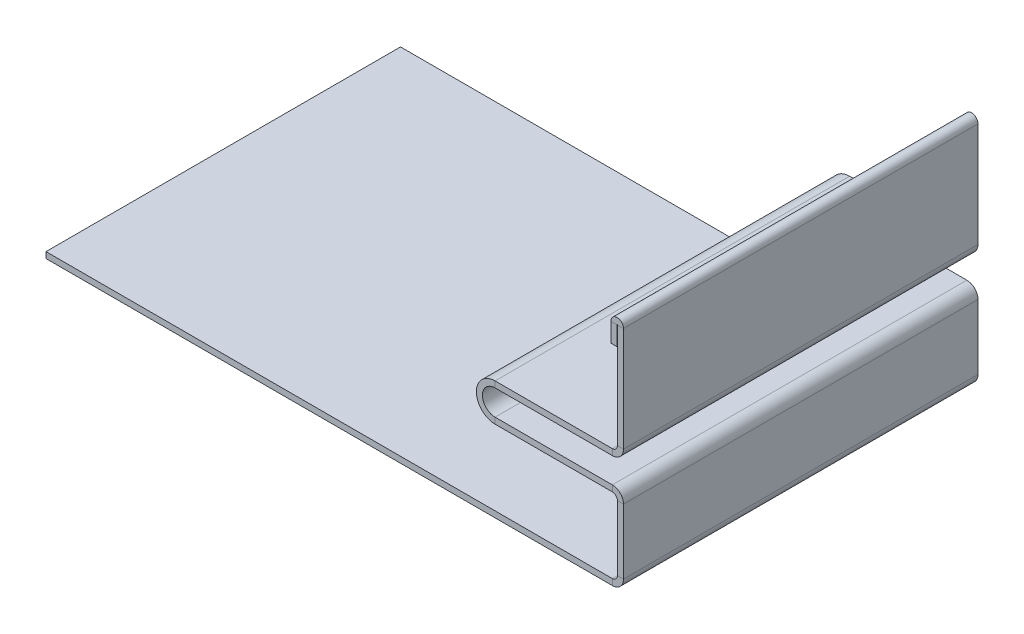
ISO-10303-21;
HEADER;
FILE_DESCRIPTION(('STEP AP214'),'2;1');
FILE_NAME('part.step','',(''),(''),'','','');
FILE_SCHEMA(('AUTOMOTIVE_DESIGN { 1 0 10303 214 1 1 1 1 }'));
ENDSEC;
DATA;
#1=APPLICATION_CONTEXT('core data for automotive mechanical design processes');
#2=APPLICATION_PROTOCOL_DEFINITION('international standard','automotive_design',2000,#1);
#3=PRODUCT_CONTEXT('',#1,'mechanical');
#4=PRODUCT('Part','Part','',(#3));
#5=PRODUCT_RELATED_PRODUCT_CATEGORY('part','',(#4));
#6=PRODUCT_DEFINITION_FORMATION('','',#4);
#7=PRODUCT_DEFINITION_CONTEXT('part definition',#1,'design');
#8=PRODUCT_DEFINITION('design','',#6,#7);
#9=PRODUCT_DEFINITION_SHAPE('','',#8);
#10=(LENGTH_UNIT() NAMED_UNIT(*) SI_UNIT(.MILLI.,.METRE.));
#11=(NAMED_UNIT(*) PLANE_ANGLE_UNIT() SI_UNIT($,.RADIAN.));
#12=(NAMED_UNIT(*) SI_UNIT($,.STERADIAN.) SOLID_ANGLE_UNIT());
#13=UNCERTAINTY_MEASURE_WITH_UNIT(LENGTH_MEASURE(1.E-05),#10,'distance_accuracy_value','');
#14=(GEOMETRIC_REPRESENTATION_CONTEXT(3) GLOBAL_UNCERTAINTY_ASSIGNED_CONTEXT((#13)) GLOBAL_UNIT_ASSIGNED_CONTEXT((#10,
#11,#12)) REPRESENTATION_CONTEXT('',''));
#15=CARTESIAN_POINT('',(0.,0.,0.));
#16=DIRECTION('',(0.,0.,1.));
#17=DIRECTION('',(1.,0.,0.));
#18=AXIS2_PLACEMENT_3D('',#15,#16,#17);
#19=CARTESIAN_POINT('',(-16.5367258771282,-22.1632741228718,-35.));
#20=DIRECTION('',(0.,0.,-1.));
#21=DIRECTION('',(-1.,0.,0.));
#22=AXIS2_PLACEMENT_3D('',#19,#20,#21);
#23=PLANE('',#22);
#24=DIRECTION('',(0.,1.,0.));
#25=VECTOR('',#24,1.);
#26=CARTESIAN_POINT('',(-15.3367258771282,-22.1632741228718,-35.));
#27=LINE('',#26,#25);
#28=CARTESIAN_POINT('',(-15.3367258771282,14.3500000000001,-35.));
#29=VERTEX_POINT('',#28);
#30=CARTESIAN_POINT('',(-15.3367258771282,27.1734517542564,-35.));
#31=VERTEX_POINT('',#30);
#32=EDGE_CURVE('E79',#29,#31,#27,.T.);
#33=ORIENTED_EDGE('',*,*,#32,.F.);
#34=DIRECTION('',(-1.,0.,0.));
#35=VECTOR('',#34,1.);
#36=CARTESIAN_POINT('',(-16.5367258771282,14.3500000000001,-35.));
#37=LINE('',#36,#35);
#38=CARTESIAN_POINT('',(-16.5367258771282,14.3500000000001,-35.));
#39=VERTEX_POINT('',#38);
#40=EDGE_CURVE('E458',#29,#39,#37,.T.);
#41=ORIENTED_EDGE('',*,*,#40,.T.);
#42=DIRECTION('',(0.,1.,0.));
#43=VECTOR('',#42,1.);
#44=CARTESIAN_POINT('',(-16.5367258771282,-22.1632741228718,-35.));
#45=LINE('',#44,#43);
#46=CARTESIAN_POINT('',(-16.5367258771282,27.1734517542564,-35.));
#47=VERTEX_POINT('',#46);
#48=EDGE_CURVE('E59',#39,#47,#45,.T.);
#49=ORIENTED_EDGE('',*,*,#48,.T.);
#50=DIRECTION('',(1.,0.,0.));
#51=VECTOR('',#50,1.);
#52=CARTESIAN_POINT('',(-16.5367258771282,27.1734517542564,-35.));
#53=LINE('',#52,#51);
#54=EDGE_CURVE('E322',#47,#31,#53,.T.);
#55=ORIENTED_EDGE('',*,*,#54,.T.);
#56=EDGE_LOOP('',(#33,#41,#49,#55));
#57=FACE_BOUND('',#56,.T.);
#58=ADVANCED_FACE('F55',(#57),#23,.T.);
#59=CARTESIAN_POINT('',(-15.3367258771282,15.3367258771282,0.));
#60=DIRECTION('',(1.,0.,0.));
#61=DIRECTION('',(0.,0.,-1.));
#62=AXIS2_PLACEMENT_3D('',#59,#60,#61);
#63=PLANE('',#62);
#64=DIRECTION('',(0.,-1.,0.));
#65=VECTOR('',#64,1.);
#66=CARTESIAN_POINT('',(-15.3367258771282,-22.1632741228718,35.));
#67=LINE('',#66,#65);
#68=CARTESIAN_POINT('',(-15.3367258771282,27.1734517542564,35.));
#69=VERTEX_POINT('',#68);
#70=CARTESIAN_POINT('',(-15.3367258771282,14.3500000000001,35.));
#71=VERTEX_POINT('',#70);
#72=EDGE_CURVE('E72',#69,#71,#67,.T.);
#73=ORIENTED_EDGE('',*,*,#72,.T.);
#74=DIRECTION('',(0.,0.,-1.));
#75=VECTOR('',#74,1.);
#76=CARTESIAN_POINT('',(-15.3367258771282,14.3500000000001,0.));
#77=LINE('',#76,#75);
#78=EDGE_CURVE('E64',#71,#29,#77,.T.);
#79=ORIENTED_EDGE('',*,*,#78,.T.);
#80=ORIENTED_EDGE('',*,*,#32,.T.);
#81=DIRECTION('',(0.,0.,1.));
#82=VECTOR('',#81,1.);
#83=CARTESIAN_POINT('',(-15.3367258771282,27.1734517542564,0.));
#84=LINE('',#83,#82);
#85=EDGE_CURVE('E320',#31,#69,#84,.T.);
#86=ORIENTED_EDGE('',*,*,#85,.T.);
#87=EDGE_LOOP('',(#73,#79,#80,#86));
#88=FACE_BOUND('',#87,.T.);
#89=ADVANCED_FACE('F463',(#88),#63,.T.);
#90=CARTESIAN_POINT('',(-16.5367258771282,-22.1632741228718,35.));
#91=DIRECTION('',(0.,0.,1.));
#92=DIRECTION('',(1.,0.,0.));
#93=AXIS2_PLACEMENT_3D('',#90,#91,#92);
#94=PLANE('',#93);
#95=DIRECTION('',(0.,-1.,0.));
#96=VECTOR('',#95,1.);
#97=CARTESIAN_POINT('',(-16.5367258771282,-22.1632741228718,35.));
#98=LINE('',#97,#96);
#99=CARTESIAN_POINT('',(-16.5367258771282,27.1734517542564,35.));
#100=VERTEX_POINT('',#99);
#101=CARTESIAN_POINT('',(-16.5367258771282,14.3500000000001,35.));
#102=VERTEX_POINT('',#101);
#103=EDGE_CURVE('E319',#100,#102,#98,.T.);
#104=ORIENTED_EDGE('',*,*,#103,.T.);
#105=DIRECTION('',(1.,0.,0.));
#106=VECTOR('',#105,1.);
#107=CARTESIAN_POINT('',(-16.5367258771282,14.3500000000001,35.));
#108=LINE('',#107,#106);
#109=EDGE_CURVE('E12',#102,#71,#108,.T.);
#110=ORIENTED_EDGE('',*,*,#109,.T.);
#111=ORIENTED_EDGE('',*,*,#72,.F.);
#112=DIRECTION('',(-1.,0.,0.));
#113=VECTOR('',#112,1.);
#114=CARTESIAN_POINT('',(-16.5367258771282,27.1734517542564,35.));
#115=LINE('',#114,#113);
#116=EDGE_CURVE('E317',#69,#100,#115,.T.);
#117=ORIENTED_EDGE('',*,*,#116,.T.);
#118=EDGE_LOOP('',(#104,#110,#111,#117));
#119=FACE_BOUND('',#118,.T.);
#120=ADVANCED_FACE('F57',(#119),#94,.T.);
#121=CARTESIAN_POINT('',(-3.18672587712816,28.1734517542564,0.));
#122=DIRECTION('',(0.,1.,0.));
#123=DIRECTION('',(0.,0.,-1.));
#124=AXIS2_PLACEMENT_3D('',#121,#122,#123);
#125=PLANE('',#124);
#126=DIRECTION('',(-1.,0.,0.));
#127=VECTOR('',#126,1.);
#128=CARTESIAN_POINT('',(34.3132741228718,28.1734517542566,-35.));
#129=LINE('',#128,#127);
#130=CARTESIAN_POINT('',(-17.5367258771282,28.1734517542564,-35.));
#131=VERTEX_POINT('',#130);
#132=CARTESIAN_POINT('',(-40.6867258771282,28.1734517542563,-35.));
#133=VERTEX_POINT('',#132);
#134=EDGE_CURVE('E423',#131,#133,#129,.T.);
#135=ORIENTED_EDGE('',*,*,#134,.F.);
#136=DIRECTION('',(0.,0.,1.));
#137=VECTOR('',#136,1.);
#138=CARTESIAN_POINT('',(-17.5367258771282,28.1734517542564,0.));
#139=LINE('',#138,#137);
#140=CARTESIAN_POINT('',(-17.5367258771282,28.1734517542564,35.));
#141=VERTEX_POINT('',#140);
#142=EDGE_CURVE('E435',#131,#141,#139,.T.);
#143=ORIENTED_EDGE('',*,*,#142,.T.);
#144=DIRECTION('',(1.,0.,0.));
#145=VECTOR('',#144,1.);
#146=CARTESIAN_POINT('',(34.3132741228719,28.1734517542566,35.));
#147=LINE('',#146,#145);
#148=CARTESIAN_POINT('',(-40.6867258771281,28.1734517542563,35.));
#149=VERTEX_POINT('',#148);
#150=EDGE_CURVE('E412',#149,#141,#147,.T.);
#151=ORIENTED_EDGE('',*,*,#150,.F.);
#152=DIRECTION('',(0.,0.,1.));
#153=VECTOR('',#152,1.);
#154=CARTESIAN_POINT('',(-40.6867258771281,28.1734517542563,35.));
#155=LINE('',#154,#153);
#156=EDGE_CURVE('E409',#133,#149,#155,.T.);
#157=ORIENTED_EDGE('',*,*,#156,.F.);
#158=EDGE_LOOP('',(#135,#143,#151,#157));
#159=FACE_BOUND('',#158,.T.);
#160=ADVANCED_FACE('F504',(#159),#125,.F.);
#161=CARTESIAN_POINT('',(-17.5367258771282,34.3734517542564,0.));
#162=DIRECTION('',(0.,1.,0.));
#163=DIRECTION('',(0.,0.,-1.));
#164=AXIS2_PLACEMENT_3D('',#161,#162,#163);
#165=PLANE('',#164);
#166=DIRECTION('',(-1.,0.,0.));
#167=VECTOR('',#166,1.);
#168=CARTESIAN_POINT('',(-17.5367258771282,34.3734517542564,-35.));
#169=LINE('',#168,#167);
#170=CARTESIAN_POINT('',(-40.6867258771282,34.3734517542563,-35.));
#171=VERTEX_POINT('',#170);
#172=CARTESIAN_POINT('',(-17.5367258771282,34.3734517542564,-35.));
#173=VERTEX_POINT('',#172);
#174=EDGE_CURVE('E385',#171,#173,#169,.F.);
#175=ORIENTED_EDGE('',*,*,#174,.T.);
#176=DIRECTION('',(0.,0.,1.));
#177=VECTOR('',#176,1.);
#178=CARTESIAN_POINT('',(-17.5367258771282,34.3734517542564,0.));
#179=LINE('',#178,#177);
#180=CARTESIAN_POINT('',(-17.5367258771282,34.3734517542564,35.));
#181=VERTEX_POINT('',#180);
#182=EDGE_CURVE('E429',#173,#181,#179,.T.);
#183=ORIENTED_EDGE('',*,*,#182,.T.);
#184=DIRECTION('',(-1.,0.,0.));
#185=VECTOR('',#184,1.);
#186=CARTESIAN_POINT('',(-17.5367258771282,34.3734517542564,35.));
#187=LINE('',#186,#185);
#188=CARTESIAN_POINT('',(-40.6867258771282,34.3734517542563,35.));
#189=VERTEX_POINT('',#188);
#190=EDGE_CURVE('E401',#181,#189,#187,.T.);
#191=ORIENTED_EDGE('',*,*,#190,.T.);
#192=DIRECTION('',(0.,0.,-1.));
#193=VECTOR('',#192,1.);
#194=CARTESIAN_POINT('',(-40.6867258771282,34.3734517542563,0.));
#195=LINE('',#194,#193);
#196=EDGE_CURVE('E399',#189,#171,#195,.T.);
#197=ORIENTED_EDGE('',*,*,#196,.T.);
#198=EDGE_LOOP('',(#175,#183,#191,#197));
#199=FACE_BOUND('',#198,.T.);
#200=ADVANCED_FACE('F529',(#199),#165,.F.);
#201=CARTESIAN_POINT('',(34.3132741228718,28.1734517542566,-35.));
#202=DIRECTION('',(0.,0.,-1.));
#203=DIRECTION('',(0.,-1.,0.));
#204=AXIS2_PLACEMENT_3D('',#201,#202,#203);
#205=PLANE('',#204);
#206=DIRECTION('',(0.,1.,0.));
#207=VECTOR('',#206,1.);
#208=CARTESIAN_POINT('',(-17.5367258771282,28.1734517542564,-35.));
#209=LINE('',#208,#207);
#210=CARTESIAN_POINT('',(-17.5367258771282,29.3734517542564,-35.));
#211=VERTEX_POINT('',#210);
#212=EDGE_CURVE('E442',#131,#211,#209,.T.);
#213=ORIENTED_EDGE('',*,*,#212,.F.);
#214=ORIENTED_EDGE('',*,*,#134,.T.);
#215=DIRECTION('',(0.,1.,0.));
#216=VECTOR('',#215,1.);
#217=CARTESIAN_POINT('',(-40.6867258771282,28.1734517542563,-35.));
#218=LINE('',#217,#216);
#219=CARTESIAN_POINT('',(-40.6867258771282,29.3734517542563,-35.));
#220=VERTEX_POINT('',#219);
#221=EDGE_CURVE('E416',#133,#220,#218,.T.);
#222=ORIENTED_EDGE('',*,*,#221,.T.);
#223=DIRECTION('',(-1.,0.,0.));
#224=VECTOR('',#223,1.);
#225=CARTESIAN_POINT('',(34.3132741228718,29.3734517542566,-35.));
#226=LINE('',#225,#224);
#227=EDGE_CURVE('E413',#211,#220,#226,.T.);
#228=ORIENTED_EDGE('',*,*,#227,.F.);
#229=EDGE_LOOP('',(#213,#214,#222,#228));
#230=FACE_BOUND('',#229,.T.);
#231=ADVANCED_FACE('F481',(#230),#205,.T.);
#232=CARTESIAN_POINT('',(34.3132741228719,28.1734517542566,35.));
#233=DIRECTION('',(0.,0.,1.));
#234=DIRECTION('',(0.,1.,0.));
#235=AXIS2_PLACEMENT_3D('',#232,#233,#234);
#236=PLANE('',#235);
#237=DIRECTION('',(0.,-1.,0.));
#238=VECTOR('',#237,1.);
#239=CARTESIAN_POINT('',(-17.5367258771282,28.1734517542564,35.));
#240=LINE('',#239,#238);
#241=CARTESIAN_POINT('',(-17.5367258771282,29.3734517542564,35.));
#242=VERTEX_POINT('',#241);
#243=EDGE_CURVE('E448',#242,#141,#240,.T.);
#244=ORIENTED_EDGE('',*,*,#243,.F.);
#245=DIRECTION('',(1.,0.,0.));
#246=VECTOR('',#245,1.);
#247=CARTESIAN_POINT('',(34.3132741228718,29.3734517542566,35.));
#248=LINE('',#247,#246);
#249=CARTESIAN_POINT('',(-40.6867258771282,29.3734517542563,35.));
#250=VERTEX_POINT('',#249);
#251=EDGE_CURVE('E415',#250,#242,#248,.T.);
#252=ORIENTED_EDGE('',*,*,#251,.F.);
#253=DIRECTION('',(0.,1.,0.));
#254=VECTOR('',#253,1.);
#255=CARTESIAN_POINT('',(-40.6867258771281,28.1734517542563,35.));
#256=LINE('',#255,#254);
#257=EDGE_CURVE('E420',#149,#250,#256,.T.);
#258=ORIENTED_EDGE('',*,*,#257,.F.);
#259=ORIENTED_EDGE('',*,*,#150,.T.);
#260=EDGE_LOOP('',(#244,#252,#258,#259));
#261=FACE_BOUND('',#260,.T.);
#262=ADVANCED_FACE('F491',(#261),#236,.T.);
#263=CARTESIAN_POINT('',(-3.18672587712817,29.3734517542564,0.));
#264=DIRECTION('',(0.,1.,0.));
#265=DIRECTION('',(0.,0.,-1.));
#266=AXIS2_PLACEMENT_3D('',#263,#264,#265);
#267=PLANE('',#266);
#268=DIRECTION('',(0.,0.,1.));
#269=VECTOR('',#268,1.);
#270=CARTESIAN_POINT('',(-17.5367258771282,29.3734517542564,0.));
#271=LINE('',#270,#269);
#272=EDGE_CURVE('E445',#211,#242,#271,.T.);
#273=ORIENTED_EDGE('',*,*,#272,.F.);
#274=ORIENTED_EDGE('',*,*,#227,.T.);
#275=DIRECTION('',(0.,0.,1.));
#276=VECTOR('',#275,1.);
#277=CARTESIAN_POINT('',(-40.6867258771282,29.3734517542563,35.));
#278=LINE('',#277,#276);
#279=EDGE_CURVE('E408',#220,#250,#278,.T.);
#280=ORIENTED_EDGE('',*,*,#279,.T.);
#281=ORIENTED_EDGE('',*,*,#251,.T.);
#282=EDGE_LOOP('',(#273,#274,#280,#281));
#283=FACE_BOUND('',#282,.T.);
#284=ADVANCED_FACE('F487',(#283),#267,.T.);
#285=CARTESIAN_POINT('',(-17.5367258771282,35.5734517542564,35.));
#286=DIRECTION('',(0.,0.,-1.));
#287=DIRECTION('',(-1.,0.,0.));
#288=AXIS2_PLACEMENT_3D('',#285,#286,#287);
#289=PLANE('',#288);
#290=DIRECTION('',(0.,-1.,0.));
#291=VECTOR('',#290,1.);
#292=CARTESIAN_POINT('',(-17.5367258771282,35.5734517542564,35.));
#293=LINE('',#292,#291);
#294=CARTESIAN_POINT('',(-17.5367258771282,35.5734517542564,35.));
#295=VERTEX_POINT('',#294);
#296=EDGE_CURVE('E426',#295,#181,#293,.T.);
#297=ORIENTED_EDGE('',*,*,#296,.F.);
#298=DIRECTION('',(-1.,0.,0.));
#299=VECTOR('',#298,1.);
#300=CARTESIAN_POINT('',(-17.5367258771282,35.5734517542564,35.));
#301=LINE('',#300,#299);
#302=CARTESIAN_POINT('',(-40.6867258771282,35.5734517542563,35.));
#303=VERTEX_POINT('',#302);
#304=EDGE_CURVE('E397',#295,#303,#301,.T.);
#305=ORIENTED_EDGE('',*,*,#304,.T.);
#306=DIRECTION('',(0.,1.,0.));
#307=VECTOR('',#306,1.);
#308=CARTESIAN_POINT('',(-40.6867258771282,35.5734517542563,35.));
#309=LINE('',#308,#307);
#310=EDGE_CURVE('E402',#189,#303,#309,.T.);
#311=ORIENTED_EDGE('',*,*,#310,.F.);
#312=ORIENTED_EDGE('',*,*,#190,.F.);
#313=EDGE_LOOP('',(#297,#305,#311,#312));
#314=FACE_BOUND('',#313,.T.);
#315=ADVANCED_FACE('F524',(#314),#289,.F.);
#316=CARTESIAN_POINT('',(-17.5367258771282,35.5734517542564,-35.));
#317=DIRECTION('',(0.,0.,1.));
#318=DIRECTION('',(1.,0.,0.));
#319=AXIS2_PLACEMENT_3D('',#316,#317,#318);
#320=PLANE('',#319);
#321=DIRECTION('',(0.,1.,0.));
#322=VECTOR('',#321,1.);
#323=CARTESIAN_POINT('',(-17.5367258771282,35.5734517542564,-35.));
#324=LINE('',#323,#322);
#325=CARTESIAN_POINT('',(-17.5367258771282,35.5734517542564,-35.));
#326=VERTEX_POINT('',#325);
#327=EDGE_CURVE('E432',#173,#326,#324,.T.);
#328=ORIENTED_EDGE('',*,*,#327,.F.);
#329=ORIENTED_EDGE('',*,*,#174,.F.);
#330=DIRECTION('',(0.,1.,0.));
#331=VECTOR('',#330,1.);
#332=CARTESIAN_POINT('',(-40.6867258771282,35.5734517542563,-35.));
#333=LINE('',#332,#331);
#334=CARTESIAN_POINT('',(-40.6867258771282,35.5734517542563,-35.));
#335=VERTEX_POINT('',#334);
#336=EDGE_CURVE('E405',#171,#335,#333,.T.);
#337=ORIENTED_EDGE('',*,*,#336,.T.);
#338=DIRECTION('',(1.,0.,0.));
#339=VECTOR('',#338,1.);
#340=CARTESIAN_POINT('',(-17.5367258771282,35.5734517542564,-35.));
#341=LINE('',#340,#339);
#342=EDGE_CURVE('E398',#335,#326,#341,.T.);
#343=ORIENTED_EDGE('',*,*,#342,.T.);
#344=EDGE_LOOP('',(#328,#329,#337,#343));
#345=FACE_BOUND('',#344,.T.);
#346=ADVANCED_FACE('F532',(#345),#320,.F.);
#347=CARTESIAN_POINT('',(-17.5367258771282,35.5734517542564,0.));
#348=DIRECTION('',(0.,1.,0.));
#349=DIRECTION('',(0.,0.,-1.));
#350=AXIS2_PLACEMENT_3D('',#347,#348,#349);
#351=PLANE('',#350);
#352=DIRECTION('',(0.,0.,1.));
#353=VECTOR('',#352,1.);
#354=CARTESIAN_POINT('',(-17.5367258771282,35.5734517542564,0.));
#355=LINE('',#354,#353);
#356=EDGE_CURVE('E419',#326,#295,#355,.T.);
#357=ORIENTED_EDGE('',*,*,#356,.F.);
#358=ORIENTED_EDGE('',*,*,#342,.F.);
#359=DIRECTION('',(0.,0.,-1.));
#360=VECTOR('',#359,1.);
#361=CARTESIAN_POINT('',(-40.6867258771282,35.5734517542563,0.));
#362=LINE('',#361,#360);
#363=EDGE_CURVE('E394',#303,#335,#362,.T.);
#364=ORIENTED_EDGE('',*,*,#363,.F.);
#365=ORIENTED_EDGE('',*,*,#304,.F.);
#366=EDGE_LOOP('',(#357,#358,#364,#365));
#367=FACE_BOUND('',#366,.T.);
#368=ADVANCED_FACE('F516',(#367),#351,.T.);
#369=CARTESIAN_POINT('',(-40.6867258771282,31.8734517542563,-35.));
#370=DIRECTION('',(0.,0.,-1.));
#371=DIRECTION('',(0.,-1.,0.));
#372=AXIS2_PLACEMENT_3D('',#369,#370,#371);
#373=PLANE('',#372);
#374=ORIENTED_EDGE('',*,*,#336,.F.);
#375=CARTESIAN_POINT('',(-40.6867258771282,31.8734517542563,-35.));
#376=DIRECTION('',(0.,0.,1.));
#377=DIRECTION('',(0.,1.,0.));
#378=AXIS2_PLACEMENT_3D('',#375,#376,#377);
#379=CIRCLE('',#378,2.5);
#380=EDGE_CURVE('E389',#220,#171,#379,.F.);
#381=ORIENTED_EDGE('',*,*,#380,.F.);
#382=ORIENTED_EDGE('',*,*,#221,.F.);
#383=CARTESIAN_POINT('',(-40.6867258771282,31.8734517542563,-35.));
#384=DIRECTION('',(0.,0.,1.));
#385=DIRECTION('',(0.,1.,0.));
#386=AXIS2_PLACEMENT_3D('',#383,#384,#385);
#387=CIRCLE('',#386,3.7);
#388=EDGE_CURVE('E382',#133,#335,#387,.F.);
#389=ORIENTED_EDGE('',*,*,#388,.T.);
#390=EDGE_LOOP('',(#374,#381,#382,#389));
#391=FACE_BOUND('',#390,.T.);
#392=ADVANCED_FACE('F511',(#391),#373,.T.);
#393=CARTESIAN_POINT('',(-40.6867258771282,31.8734517542563,35.));
#394=DIRECTION('',(0.,0.,-1.));
#395=DIRECTION('',(0.,-1.,0.));
#396=AXIS2_PLACEMENT_3D('',#393,#394,#395);
#397=PLANE('',#396);
#398=CARTESIAN_POINT('',(-40.6867258771282,31.8734517542563,35.));
#399=DIRECTION('',(0.,0.,1.));
#400=DIRECTION('',(0.,1.,0.));
#401=AXIS2_PLACEMENT_3D('',#398,#399,#400);
#402=CIRCLE('',#401,2.5);
#403=EDGE_CURVE('E377',#189,#250,#402,.T.);
#404=ORIENTED_EDGE('',*,*,#403,.F.);
#405=ORIENTED_EDGE('',*,*,#310,.T.);
#406=CARTESIAN_POINT('',(-40.6867258771282,31.8734517542563,35.));
#407=DIRECTION('',(0.,0.,1.));
#408=DIRECTION('',(0.,1.,0.));
#409=AXIS2_PLACEMENT_3D('',#406,#407,#408);
#410=CIRCLE('',#409,3.7);
#411=EDGE_CURVE('E386',#303,#149,#410,.T.);
#412=ORIENTED_EDGE('',*,*,#411,.T.);
#413=ORIENTED_EDGE('',*,*,#257,.T.);
#414=EDGE_LOOP('',(#404,#405,#412,#413));
#415=FACE_BOUND('',#414,.T.);
#416=ADVANCED_FACE('F521',(#415),#397,.F.);
#417=CARTESIAN_POINT('',(-40.6867258771282,31.8734517542563,35.));
#418=DIRECTION('',(0.,0.,1.));
#419=DIRECTION('',(0.,1.,0.));
#420=AXIS2_PLACEMENT_3D('',#417,#418,#419);
#421=CYLINDRICAL_SURFACE('',#420,3.7);
#422=ORIENTED_EDGE('',*,*,#156,.T.);
#423=ORIENTED_EDGE('',*,*,#411,.F.);
#424=ORIENTED_EDGE('',*,*,#363,.T.);
#425=ORIENTED_EDGE('',*,*,#388,.F.);
#426=EDGE_LOOP('',(#422,#423,#424,#425));
#427=FACE_BOUND('',#426,.T.);
#428=ADVANCED_FACE('F512',(#427),#421,.T.);
#429=CARTESIAN_POINT('',(-40.6867258771282,31.8734517542563,35.));
#430=DIRECTION('',(0.,0.,1.));
#431=DIRECTION('',(0.,1.,0.));
#432=AXIS2_PLACEMENT_3D('',#429,#430,#431);
#433=CYLINDRICAL_SURFACE('',#432,2.5);
#434=ORIENTED_EDGE('',*,*,#279,.F.);
#435=ORIENTED_EDGE('',*,*,#380,.T.);
#436=ORIENTED_EDGE('',*,*,#196,.F.);
#437=ORIENTED_EDGE('',*,*,#403,.T.);
#438=EDGE_LOOP('',(#434,#435,#436,#437));
#439=FACE_BOUND('',#438,.T.);
#440=ADVANCED_FACE('F526',(#439),#433,.F.);
#441=CARTESIAN_POINT('',(-17.5367258771282,36.5734517542564,-35.));
#442=DIRECTION('',(0.,0.,1.));
#443=DIRECTION('',(0.,1.,0.));
#444=AXIS2_PLACEMENT_3D('',#441,#442,#443);
#445=PLANE('',#444);
#446=DIRECTION('',(-1.,0.,0.));
#447=VECTOR('',#446,1.);
#448=CARTESIAN_POINT('',(-16.5367258771282,36.5734517542564,-35.));
#449=LINE('',#448,#447);
#450=CARTESIAN_POINT('',(-15.3367258771282,36.5734517542564,-35.));
#451=VERTEX_POINT('',#450);
#452=CARTESIAN_POINT('',(-16.5367258771282,36.5734517542564,-35.));
#453=VERTEX_POINT('',#452);
#454=EDGE_CURVE('E342',#451,#453,#449,.T.);
#455=ORIENTED_EDGE('',*,*,#454,.F.);
#456=CARTESIAN_POINT('',(-17.5367258771282,36.5734517542564,-35.));
#457=DIRECTION('',(0.,0.,-1.));
#458=DIRECTION('',(-1.,0.,0.));
#459=AXIS2_PLACEMENT_3D('',#456,#457,#458);
#460=CIRCLE('',#459,2.2);
#461=EDGE_CURVE('E341',#451,#173,#460,.T.);
#462=ORIENTED_EDGE('',*,*,#461,.T.);
#463=ORIENTED_EDGE('',*,*,#327,.T.);
#464=CARTESIAN_POINT('',(-17.5367258771282,36.5734517542564,-35.));
#465=DIRECTION('',(0.,0.,-1.));
#466=DIRECTION('',(0.,1.,0.));
#467=AXIS2_PLACEMENT_3D('',#464,#465,#466);
#468=CIRCLE('',#467,1.);
#469=EDGE_CURVE('E370',#453,#326,#468,.T.);
#470=ORIENTED_EDGE('',*,*,#469,.F.);
#471=EDGE_LOOP('',(#455,#462,#463,#470));
#472=FACE_BOUND('',#471,.T.);
#473=ADVANCED_FACE('F541',(#472),#445,.F.);
#474=CARTESIAN_POINT('',(-17.5367258771282,36.5734517542564,35.));
#475=DIRECTION('',(0.,0.,-1.));
#476=DIRECTION('',(0.,-1.,0.));
#477=AXIS2_PLACEMENT_3D('',#474,#475,#476);
#478=PLANE('',#477);
#479=CARTESIAN_POINT('',(-17.5367258771282,36.5734517542564,35.));
#480=DIRECTION('',(0.,0.,-1.));
#481=DIRECTION('',(-1.,0.,0.));
#482=AXIS2_PLACEMENT_3D('',#479,#480,#481);
#483=CIRCLE('',#482,2.2);
#484=CARTESIAN_POINT('',(-15.3367258771282,36.5734517542564,35.));
#485=VERTEX_POINT('',#484);
#486=EDGE_CURVE('E374',#181,#485,#483,.F.);
#487=ORIENTED_EDGE('',*,*,#486,.T.);
#488=DIRECTION('',(1.,0.,0.));
#489=VECTOR('',#488,1.);
#490=CARTESIAN_POINT('',(-16.5367258771282,36.5734517542564,35.));
#491=LINE('',#490,#489);
#492=CARTESIAN_POINT('',(-16.5367258771282,36.5734517542564,35.));
#493=VERTEX_POINT('',#492);
#494=EDGE_CURVE('E354',#493,#485,#491,.T.);
#495=ORIENTED_EDGE('',*,*,#494,.F.);
#496=CARTESIAN_POINT('',(-17.5367258771282,36.5734517542564,35.));
#497=DIRECTION('',(0.,0.,1.));
#498=DIRECTION('',(0.,-1.,0.));
#499=AXIS2_PLACEMENT_3D('',#496,#497,#498);
#500=CIRCLE('',#499,1.);
#501=EDGE_CURVE('E373',#295,#493,#500,.T.);
#502=ORIENTED_EDGE('',*,*,#501,.F.);
#503=ORIENTED_EDGE('',*,*,#296,.T.);
#504=EDGE_LOOP('',(#487,#495,#502,#503));
#505=FACE_BOUND('',#504,.T.);
#506=ADVANCED_FACE('F556',(#505),#478,.F.);
#507=CARTESIAN_POINT('',(-17.5367258771282,36.5734517542564,70.0553819975075));
#508=DIRECTION('',(0.,0.,-1.));
#509=DIRECTION('',(-1.,0.,0.));
#510=AXIS2_PLACEMENT_3D('',#507,#508,#509);
#511=CYLINDRICAL_SURFACE('',#510,1.);
#512=ORIENTED_EDGE('',*,*,#356,.T.);
#513=ORIENTED_EDGE('',*,*,#501,.T.);
#514=DIRECTION('',(0.,0.,1.));
#515=VECTOR('',#514,1.);
#516=CARTESIAN_POINT('',(-16.5367258771282,36.5734517542564,0.));
#517=LINE('',#516,#515);
#518=EDGE_CURVE('E360',#453,#493,#517,.T.);
#519=ORIENTED_EDGE('',*,*,#518,.F.);
#520=ORIENTED_EDGE('',*,*,#469,.T.);
#521=EDGE_LOOP('',(#512,#513,#519,#520));
#522=FACE_BOUND('',#521,.T.);
#523=ADVANCED_FACE('F552',(#522),#511,.F.);
#524=CARTESIAN_POINT('',(-17.5367258771282,36.5734517542564,70.0553819975075));
#525=DIRECTION('',(0.,0.,-1.));
#526=DIRECTION('',(-1.,0.,0.));
#527=AXIS2_PLACEMENT_3D('',#524,#525,#526);
#528=CYLINDRICAL_SURFACE('',#527,2.2);
#529=ORIENTED_EDGE('',*,*,#182,.F.);
#530=ORIENTED_EDGE('',*,*,#461,.F.);
#531=DIRECTION('',(0.,0.,1.));
#532=VECTOR('',#531,1.);
#533=CARTESIAN_POINT('',(-15.3367258771282,36.5734517542564,0.));
#534=LINE('',#533,#532);
#535=EDGE_CURVE('E333',#451,#485,#534,.T.);
#536=ORIENTED_EDGE('',*,*,#535,.T.);
#537=ORIENTED_EDGE('',*,*,#486,.F.);
#538=EDGE_LOOP('',(#529,#530,#536,#537));
#539=FACE_BOUND('',#538,.T.);
#540=ADVANCED_FACE('F539',(#539),#528,.T.);
#541=CARTESIAN_POINT('',(-16.5367258771282,34.0601776313846,0.));
#542=DIRECTION('',(-1.,0.,0.));
#543=DIRECTION('',(0.,0.,-1.));
#544=AXIS2_PLACEMENT_3D('',#541,#542,#543);
#545=PLANE('',#544);
#546=DIRECTION('',(0.,1.,0.));
#547=VECTOR('',#546,1.);
#548=CARTESIAN_POINT('',(-16.5367258771282,34.0601776313846,-35.));
#549=LINE('',#548,#547);
#550=CARTESIAN_POINT('',(-16.5367258771283,57.2101776313846,-35.));
#551=VERTEX_POINT('',#550);
#552=EDGE_CURVE('E339',#453,#551,#549,.T.);
#553=ORIENTED_EDGE('',*,*,#552,.F.);
#554=ORIENTED_EDGE('',*,*,#518,.T.);
#555=DIRECTION('',(0.,-1.,0.));
#556=VECTOR('',#555,1.);
#557=CARTESIAN_POINT('',(-16.5367258771282,34.0601776313846,35.));
#558=LINE('',#557,#556);
#559=CARTESIAN_POINT('',(-16.5367258771283,57.2101776313846,35.));
#560=VERTEX_POINT('',#559);
#561=EDGE_CURVE('E357',#560,#493,#558,.T.);
#562=ORIENTED_EDGE('',*,*,#561,.F.);
#563=DIRECTION('',(0.,0.,1.));
#564=VECTOR('',#563,1.);
#565=CARTESIAN_POINT('',(-16.5367258771283,57.2101776313846,0.));
#566=LINE('',#565,#564);
#567=EDGE_CURVE('E362',#551,#560,#566,.T.);
#568=ORIENTED_EDGE('',*,*,#567,.F.);
#569=EDGE_LOOP('',(#553,#554,#562,#568));
#570=FACE_BOUND('',#569,.T.);
#571=ADVANCED_FACE('F550',(#570),#545,.T.);
#572=CARTESIAN_POINT('',(-16.5367258771282,34.0601776313846,35.));
#573=DIRECTION('',(0.,0.,-1.));
#574=DIRECTION('',(0.,-1.,0.));
#575=AXIS2_PLACEMENT_3D('',#572,#573,#574);
#576=PLANE('',#575);
#577=ORIENTED_EDGE('',*,*,#561,.T.);
#578=ORIENTED_EDGE('',*,*,#494,.T.);
#579=DIRECTION('',(0.,-1.,0.));
#580=VECTOR('',#579,1.);
#581=CARTESIAN_POINT('',(-15.3367258771282,34.0601776313846,35.));
#582=LINE('',#581,#580);
#583=CARTESIAN_POINT('',(-15.3367258771283,57.2101776313846,35.));
#584=VERTEX_POINT('',#583);
#585=EDGE_CURVE('E344',#584,#485,#582,.T.);
#586=ORIENTED_EDGE('',*,*,#585,.F.);
#587=DIRECTION('',(-1.,0.,0.));
#588=VECTOR('',#587,1.);
#589=CARTESIAN_POINT('',(-16.5367258771283,57.2101776313846,35.));
#590=LINE('',#589,#588);
#591=EDGE_CURVE('E351',#584,#560,#590,.T.);
#592=ORIENTED_EDGE('',*,*,#591,.T.);
#593=EDGE_LOOP('',(#577,#578,#586,#592));
#594=FACE_BOUND('',#593,.T.);
#595=ADVANCED_FACE('F558',(#594),#576,.F.);
#596=CARTESIAN_POINT('',(-15.3367258771282,34.0601776313846,0.));
#597=DIRECTION('',(-1.,0.,0.));
#598=DIRECTION('',(0.,0.,-1.));
#599=AXIS2_PLACEMENT_3D('',#596,#597,#598);
#600=PLANE('',#599);
#601=ORIENTED_EDGE('',*,*,#535,.F.);
#602=DIRECTION('',(0.,-1.,0.));
#603=VECTOR('',#602,1.);
#604=CARTESIAN_POINT('',(-15.3367258771282,34.0601776313846,-35.));
#605=LINE('',#604,#603);
#606=CARTESIAN_POINT('',(-15.3367258771283,57.2101776313846,-35.));
#607=VERTEX_POINT('',#606);
#608=EDGE_CURVE('E349',#451,#607,#605,.F.);
#609=ORIENTED_EDGE('',*,*,#608,.T.);
#610=DIRECTION('',(0.,0.,-1.));
#611=VECTOR('',#610,1.);
#612=CARTESIAN_POINT('',(-15.3367258771283,57.2101776313846,0.));
#613=LINE('',#612,#611);
#614=EDGE_CURVE('E346',#607,#584,#613,.F.);
#615=ORIENTED_EDGE('',*,*,#614,.T.);
#616=ORIENTED_EDGE('',*,*,#585,.T.);
#617=EDGE_LOOP('',(#601,#609,#615,#616));
#618=FACE_BOUND('',#617,.T.);
#619=ADVANCED_FACE('F560',(#618),#600,.F.);
#620=CARTESIAN_POINT('',(-16.5367258771282,34.0601776313846,-35.));
#621=DIRECTION('',(0.,0.,1.));
#622=DIRECTION('',(0.,1.,0.));
#623=AXIS2_PLACEMENT_3D('',#620,#621,#622);
#624=PLANE('',#623);
#625=ORIENTED_EDGE('',*,*,#608,.F.);
#626=ORIENTED_EDGE('',*,*,#454,.T.);
#627=ORIENTED_EDGE('',*,*,#552,.T.);
#628=DIRECTION('',(-1.,0.,0.));
#629=VECTOR('',#628,1.);
#630=CARTESIAN_POINT('',(-16.5367258771283,57.2101776313846,-35.));
#631=LINE('',#630,#629);
#632=EDGE_CURVE('E365',#607,#551,#631,.T.);
#633=ORIENTED_EDGE('',*,*,#632,.F.);
#634=EDGE_LOOP('',(#625,#626,#627,#633));
#635=FACE_BOUND('',#634,.T.);
#636=ADVANCED_FACE('F544',(#635),#624,.F.);
#637=CARTESIAN_POINT('',(-17.5367258771282,27.1734517542564,-35.));
#638=DIRECTION('',(0.,0.,1.));
#639=DIRECTION('',(0.,1.,0.));
#640=AXIS2_PLACEMENT_3D('',#637,#638,#639);
#641=PLANE('',#640);
#642=ORIENTED_EDGE('',*,*,#212,.T.);
#643=CARTESIAN_POINT('',(-17.5367258771282,27.1734517542564,-35.));
#644=DIRECTION('',(0.,0.,1.));
#645=DIRECTION('',(0.,1.,0.));
#646=AXIS2_PLACEMENT_3D('',#643,#644,#645);
#647=CIRCLE('',#646,2.2);
#648=EDGE_CURVE('E336',#211,#31,#647,.F.);
#649=ORIENTED_EDGE('',*,*,#648,.T.);
#650=ORIENTED_EDGE('',*,*,#54,.F.);
#651=CARTESIAN_POINT('',(-17.5367258771282,27.1734517542564,-35.));
#652=DIRECTION('',(0.,0.,-1.));
#653=DIRECTION('',(0.,1.,0.));
#654=AXIS2_PLACEMENT_3D('',#651,#652,#653);
#655=CIRCLE('',#654,1.);
#656=EDGE_CURVE('E326',#131,#47,#655,.T.);
#657=ORIENTED_EDGE('',*,*,#656,.F.);
#658=EDGE_LOOP('',(#642,#649,#650,#657));
#659=FACE_BOUND('',#658,.T.);
#660=ADVANCED_FACE('F477',(#659),#641,.F.);
#661=CARTESIAN_POINT('',(-17.5367258771282,27.1734517542564,35.));
#662=DIRECTION('',(0.,0.,-1.));
#663=DIRECTION('',(0.,-1.,0.));
#664=AXIS2_PLACEMENT_3D('',#661,#662,#663);
#665=PLANE('',#664);
#666=ORIENTED_EDGE('',*,*,#116,.F.);
#667=CARTESIAN_POINT('',(-17.5367258771282,27.1734517542564,35.));
#668=DIRECTION('',(0.,0.,1.));
#669=DIRECTION('',(0.,1.,0.));
#670=AXIS2_PLACEMENT_3D('',#667,#668,#669);
#671=CIRCLE('',#670,2.2);
#672=EDGE_CURVE('E330',#69,#242,#671,.T.);
#673=ORIENTED_EDGE('',*,*,#672,.T.);
#674=ORIENTED_EDGE('',*,*,#243,.T.);
#675=CARTESIAN_POINT('',(-17.5367258771282,27.1734517542564,35.));
#676=DIRECTION('',(0.,0.,1.));
#677=DIRECTION('',(0.,-1.,0.));
#678=AXIS2_PLACEMENT_3D('',#675,#676,#677);
#679=CIRCLE('',#678,1.);
#680=EDGE_CURVE('E329',#100,#141,#679,.T.);
#681=ORIENTED_EDGE('',*,*,#680,.F.);
#682=EDGE_LOOP('',(#666,#673,#674,#681));
#683=FACE_BOUND('',#682,.T.);
#684=ADVANCED_FACE('F495',(#683),#665,.F.);
#685=CARTESIAN_POINT('',(-17.5367258771282,27.1734517542564,-70.0553819975075));
#686=DIRECTION('',(0.,0.,1.));
#687=DIRECTION('',(0.,1.,0.));
#688=AXIS2_PLACEMENT_3D('',#685,#686,#687);
#689=CYLINDRICAL_SURFACE('',#688,1.);
#690=ORIENTED_EDGE('',*,*,#680,.T.);
#691=ORIENTED_EDGE('',*,*,#142,.F.);
#692=ORIENTED_EDGE('',*,*,#656,.T.);
#693=DIRECTION('',(0.,0.,1.));
#694=VECTOR('',#693,1.);
#695=CARTESIAN_POINT('',(-16.5367258771282,27.1734517542564,0.));
#696=LINE('',#695,#694);
#697=EDGE_CURVE('E315',#47,#100,#696,.T.);
#698=ORIENTED_EDGE('',*,*,#697,.T.);
#699=EDGE_LOOP('',(#690,#691,#692,#698));
#700=FACE_BOUND('',#699,.T.);
#701=ADVANCED_FACE('F502',(#700),#689,.F.);
#702=CARTESIAN_POINT('',(-17.5367258771282,27.1734517542564,-70.0553819975075));
#703=DIRECTION('',(0.,0.,1.));
#704=DIRECTION('',(0.,1.,0.));
#705=AXIS2_PLACEMENT_3D('',#702,#703,#704);
#706=CYLINDRICAL_SURFACE('',#705,2.2);
#707=ORIENTED_EDGE('',*,*,#672,.F.);
#708=ORIENTED_EDGE('',*,*,#85,.F.);
#709=ORIENTED_EDGE('',*,*,#648,.F.);
#710=ORIENTED_EDGE('',*,*,#272,.T.);
#711=EDGE_LOOP('',(#707,#708,#709,#710));
#712=FACE_BOUND('',#711,.T.);
#713=ADVANCED_FACE('F476',(#712),#706,.T.);
#714=CARTESIAN_POINT('',(-16.5367258771282,15.3367258771282,0.));
#715=DIRECTION('',(1.,0.,0.));
#716=DIRECTION('',(0.,0.,-1.));
#717=AXIS2_PLACEMENT_3D('',#714,#715,#716);
#718=PLANE('',#717);
#719=DIRECTION('',(0.,0.,-1.));
#720=VECTOR('',#719,1.);
#721=CARTESIAN_POINT('',(-16.5367258771282,14.3500000000001,0.));
#722=LINE('',#721,#720);
#723=EDGE_CURVE('E451',#102,#39,#722,.T.);
#724=ORIENTED_EDGE('',*,*,#723,.F.);
#725=ORIENTED_EDGE('',*,*,#103,.F.);
#726=ORIENTED_EDGE('',*,*,#697,.F.);
#727=ORIENTED_EDGE('',*,*,#48,.F.);
#728=EDGE_LOOP('',(#724,#725,#726,#727));
#729=FACE_BOUND('',#728,.T.);
#730=ADVANCED_FACE('F500',(#729),#718,.F.);
#731=CARTESIAN_POINT('',(-17.8367258771283,55.3351776313845,-35.));
#732=DIRECTION('',(0.,0.,1.));
#733=DIRECTION('',(0.,1.,0.));
#734=AXIS2_PLACEMENT_3D('',#731,#732,#733);
#735=PLANE('',#734);
#736=DIRECTION('',(-1.,0.,0.));
#737=VECTOR('',#736,1.);
#738=CARTESIAN_POINT('',(-17.8367258771283,57.2101776313845,-35.));
#739=LINE('',#738,#737);
#740=CARTESIAN_POINT('',(-16.6367258771283,57.2101776313846,-35.));
#741=VERTEX_POINT('',#740);
#742=CARTESIAN_POINT('',(-17.8367258771283,57.2101776313845,-35.));
#743=VERTEX_POINT('',#742);
#744=EDGE_CURVE('E309',#741,#743,#739,.T.);
#745=ORIENTED_EDGE('',*,*,#744,.F.);
#746=DIRECTION('',(0.,-1.,0.));
#747=VECTOR('',#746,1.);
#748=CARTESIAN_POINT('',(-16.6367258771283,55.3351776313846,-35.));
#749=LINE('',#748,#747);
#750=CARTESIAN_POINT('',(-16.6367258771283,53.4601776313846,-35.));
#751=VERTEX_POINT('',#750);
#752=EDGE_CURVE('E300',#751,#741,#749,.F.);
#753=ORIENTED_EDGE('',*,*,#752,.F.);
#754=DIRECTION('',(-1.,0.,0.));
#755=VECTOR('',#754,1.);
#756=CARTESIAN_POINT('',(-17.8367258771283,53.4601776313845,-35.));
#757=LINE('',#756,#755);
#758=CARTESIAN_POINT('',(-17.8367258771283,53.4601776313845,-35.));
#759=VERTEX_POINT('',#758);
#760=EDGE_CURVE('E307',#751,#759,#757,.T.);
#761=ORIENTED_EDGE('',*,*,#760,.T.);
#762=DIRECTION('',(0.,1.,0.));
#763=VECTOR('',#762,1.);
#764=CARTESIAN_POINT('',(-17.8367258771283,55.3351776313845,-35.));
#765=LINE('',#764,#763);
#766=EDGE_CURVE('E288',#759,#743,#765,.T.);
#767=ORIENTED_EDGE('',*,*,#766,.T.);
#768=EDGE_LOOP('',(#745,#753,#761,#767));
#769=FACE_BOUND('',#768,.T.);
#770=ADVANCED_FACE('F576',(#769),#735,.F.);
#771=CARTESIAN_POINT('',(-17.8367258771283,53.4601776313845,0.));
#772=DIRECTION('',(0.,1.,0.));
#773=DIRECTION('',(0.,0.,-1.));
#774=AXIS2_PLACEMENT_3D('',#771,#772,#773);
#775=PLANE('',#774);
#776=ORIENTED_EDGE('',*,*,#760,.F.);
#777=DIRECTION('',(0.,0.,1.));
#778=VECTOR('',#777,1.);
#779=CARTESIAN_POINT('',(-16.6367258771283,53.4601776313846,0.));
#780=LINE('',#779,#778);
#781=CARTESIAN_POINT('',(-16.6367258771283,53.4601776313846,35.));
#782=VERTEX_POINT('',#781);
#783=EDGE_CURVE('E297',#782,#751,#780,.F.);
#784=ORIENTED_EDGE('',*,*,#783,.F.);
#785=DIRECTION('',(-1.,0.,0.));
#786=VECTOR('',#785,1.);
#787=CARTESIAN_POINT('',(-17.8367258771283,53.4601776313845,35.));
#788=LINE('',#787,#786);
#789=CARTESIAN_POINT('',(-17.8367258771283,53.4601776313845,35.));
#790=VERTEX_POINT('',#789);
#791=EDGE_CURVE('E287',#782,#790,#788,.T.);
#792=ORIENTED_EDGE('',*,*,#791,.T.);
#793=DIRECTION('',(0.,0.,-1.));
#794=VECTOR('',#793,1.);
#795=CARTESIAN_POINT('',(-17.8367258771283,53.4601776313845,0.));
#796=LINE('',#795,#794);
#797=EDGE_CURVE('E284',#790,#759,#796,.T.);
#798=ORIENTED_EDGE('',*,*,#797,.T.);
#799=EDGE_LOOP('',(#776,#784,#792,#798));
#800=FACE_BOUND('',#799,.T.);
#801=ADVANCED_FACE('F591',(#800),#775,.F.);
#802=CARTESIAN_POINT('',(-17.8367258771283,55.3351776313845,35.));
#803=DIRECTION('',(0.,0.,-1.));
#804=DIRECTION('',(0.,-1.,0.));
#805=AXIS2_PLACEMENT_3D('',#802,#803,#804);
#806=PLANE('',#805);
#807=DIRECTION('',(0.,-1.,0.));
#808=VECTOR('',#807,1.);
#809=CARTESIAN_POINT('',(-16.6367258771283,55.3351776313846,35.));
#810=LINE('',#809,#808);
#811=CARTESIAN_POINT('',(-16.6367258771283,57.2101776313846,35.));
#812=VERTEX_POINT('',#811);
#813=EDGE_CURVE('E275',#812,#782,#810,.T.);
#814=ORIENTED_EDGE('',*,*,#813,.F.);
#815=DIRECTION('',(-1.,0.,0.));
#816=VECTOR('',#815,1.);
#817=CARTESIAN_POINT('',(-17.8367258771283,57.2101776313845,35.));
#818=LINE('',#817,#816);
#819=CARTESIAN_POINT('',(-17.8367258771283,57.2101776313845,35.));
#820=VERTEX_POINT('',#819);
#821=EDGE_CURVE('E312',#812,#820,#818,.T.);
#822=ORIENTED_EDGE('',*,*,#821,.T.);
#823=DIRECTION('',(0.,-1.,0.));
#824=VECTOR('',#823,1.);
#825=CARTESIAN_POINT('',(-17.8367258771283,55.3351776313845,35.));
#826=LINE('',#825,#824);
#827=EDGE_CURVE('E294',#820,#790,#826,.T.);
#828=ORIENTED_EDGE('',*,*,#827,.T.);
#829=ORIENTED_EDGE('',*,*,#791,.F.);
#830=EDGE_LOOP('',(#814,#822,#828,#829));
#831=FACE_BOUND('',#830,.T.);
#832=ADVANCED_FACE('F589',(#831),#806,.F.);
#833=CARTESIAN_POINT('',(-17.8367258771283,55.3351776313845,0.));
#834=DIRECTION('',(-1.,0.,0.));
#835=DIRECTION('',(0.,-1.,0.));
#836=AXIS2_PLACEMENT_3D('',#833,#834,#835);
#837=PLANE('',#836);
#838=ORIENTED_EDGE('',*,*,#797,.F.);
#839=ORIENTED_EDGE('',*,*,#827,.F.);
#840=DIRECTION('',(0.,0.,1.));
#841=VECTOR('',#840,1.);
#842=CARTESIAN_POINT('',(-17.8367258771283,57.2101776313845,0.));
#843=LINE('',#842,#841);
#844=EDGE_CURVE('E291',#743,#820,#843,.T.);
#845=ORIENTED_EDGE('',*,*,#844,.F.);
#846=ORIENTED_EDGE('',*,*,#766,.F.);
#847=EDGE_LOOP('',(#838,#839,#845,#846));
#848=FACE_BOUND('',#847,.T.);
#849=ADVANCED_FACE('F574',(#848),#837,.T.);
#850=CARTESIAN_POINT('',(-16.6367258771283,55.3351776313846,0.));
#851=DIRECTION('',(-1.,0.,0.));
#852=DIRECTION('',(0.,-1.,0.));
#853=AXIS2_PLACEMENT_3D('',#850,#851,#852);
#854=PLANE('',#853);
#855=ORIENTED_EDGE('',*,*,#783,.T.);
#856=ORIENTED_EDGE('',*,*,#752,.T.);
#857=DIRECTION('',(0.,0.,1.));
#858=VECTOR('',#857,1.);
#859=CARTESIAN_POINT('',(-16.6367258771283,57.2101776313846,0.));
#860=LINE('',#859,#858);
#861=EDGE_CURVE('E303',#741,#812,#860,.T.);
#862=ORIENTED_EDGE('',*,*,#861,.T.);
#863=ORIENTED_EDGE('',*,*,#813,.T.);
#864=EDGE_LOOP('',(#855,#856,#862,#863));
#865=FACE_BOUND('',#864,.T.);
#866=ADVANCED_FACE('F586',(#865),#854,.F.);
#867=CARTESIAN_POINT('',(-16.5867258771283,57.2101776313846,35.));
#868=DIRECTION('',(0.,0.,1.));
#869=DIRECTION('',(1.,0.,0.));
#870=AXIS2_PLACEMENT_3D('',#867,#868,#869);
#871=PLANE('',#870);
#872=ORIENTED_EDGE('',*,*,#821,.F.);
#873=CARTESIAN_POINT('',(-16.5867258771283,57.2101776313846,35.));
#874=DIRECTION('',(0.,0.,-1.));
#875=DIRECTION('',(-1.,0.,0.));
#876=AXIS2_PLACEMENT_3D('',#873,#874,#875);
#877=CIRCLE('',#876,0.0499999999999997);
#878=EDGE_CURVE('E279',#560,#812,#877,.F.);
#879=ORIENTED_EDGE('',*,*,#878,.F.);
#880=ORIENTED_EDGE('',*,*,#591,.F.);
#881=CARTESIAN_POINT('',(-16.5867258771283,57.2101776313846,35.));
#882=DIRECTION('',(0.,0.,-1.));
#883=DIRECTION('',(-1.,0.,0.));
#884=AXIS2_PLACEMENT_3D('',#881,#882,#883);
#885=CIRCLE('',#884,1.25);
#886=EDGE_CURVE('E272',#584,#820,#885,.F.);
#887=ORIENTED_EDGE('',*,*,#886,.T.);
#888=EDGE_LOOP('',(#872,#879,#880,#887));
#889=FACE_BOUND('',#888,.T.);
#890=ADVANCED_FACE('F569',(#889),#871,.T.);
#891=CARTESIAN_POINT('',(-16.5867258771283,57.2101776313846,-35.));
#892=DIRECTION('',(0.,0.,1.));
#893=DIRECTION('',(1.,0.,0.));
#894=AXIS2_PLACEMENT_3D('',#891,#892,#893);
#895=PLANE('',#894);
#896=CARTESIAN_POINT('',(-16.5867258771283,57.2101776313846,-35.));
#897=DIRECTION('',(0.,0.,-1.));
#898=DIRECTION('',(-1.,0.,0.));
#899=AXIS2_PLACEMENT_3D('',#896,#897,#898);
#900=CIRCLE('',#899,0.0499999999999997);
#901=EDGE_CURVE('E228',#741,#551,#900,.T.);
#902=ORIENTED_EDGE('',*,*,#901,.F.);
#903=ORIENTED_EDGE('',*,*,#744,.T.);
#904=CARTESIAN_POINT('',(-16.5867258771283,57.2101776313846,-35.));
#905=DIRECTION('',(0.,0.,-1.));
#906=DIRECTION('',(-1.,0.,0.));
#907=AXIS2_PLACEMENT_3D('',#904,#905,#906);
#908=CIRCLE('',#907,1.25);
#909=EDGE_CURVE('E276',#743,#607,#908,.T.);
#910=ORIENTED_EDGE('',*,*,#909,.T.);
#911=ORIENTED_EDGE('',*,*,#632,.T.);
#912=EDGE_LOOP('',(#902,#903,#910,#911));
#913=FACE_BOUND('',#912,.T.);
#914=ADVANCED_FACE('F580',(#913),#895,.F.);
#915=CARTESIAN_POINT('',(-16.5867258771283,57.2101776313846,-35.));
#916=DIRECTION('',(0.,0.,-1.));
#917=DIRECTION('',(-1.,0.,0.));
#918=AXIS2_PLACEMENT_3D('',#915,#916,#917);
#919=CYLINDRICAL_SURFACE('',#918,1.25);
#920=ORIENTED_EDGE('',*,*,#614,.F.);
#921=ORIENTED_EDGE('',*,*,#909,.F.);
#922=ORIENTED_EDGE('',*,*,#844,.T.);
#923=ORIENTED_EDGE('',*,*,#886,.F.);
#924=EDGE_LOOP('',(#920,#921,#922,#923));
#925=FACE_BOUND('',#924,.T.);
#926=ADVANCED_FACE('F570',(#925),#919,.T.);
#927=CARTESIAN_POINT('',(-16.5867258771283,57.2101776313846,-35.));
#928=DIRECTION('',(0.,0.,-1.));
#929=DIRECTION('',(-1.,0.,0.));
#930=AXIS2_PLACEMENT_3D('',#927,#928,#929);
#931=CYLINDRICAL_SURFACE('',#930,0.0499999999999997);
#932=ORIENTED_EDGE('',*,*,#567,.T.);
#933=ORIENTED_EDGE('',*,*,#878,.T.);
#934=ORIENTED_EDGE('',*,*,#861,.F.);
#935=ORIENTED_EDGE('',*,*,#901,.T.);
#936=EDGE_LOOP('',(#932,#933,#934,#935));
#937=FACE_BOUND('',#936,.T.);
#938=ADVANCED_FACE('F583',(#937),#931,.F.);
#939=CARTESIAN_POINT('',(-14.0367258771282,13.3500000000001,0.));
#940=DIRECTION('',(0.,-1.,0.));
#941=DIRECTION('',(0.,0.,-1.));
#942=AXIS2_PLACEMENT_3D('',#939,#940,#941);
#943=PLANE('',#942);
#944=DIRECTION('',(0.,0.,-1.));
#945=VECTOR('',#944,1.);
#946=CARTESIAN_POINT('',(-17.5367258771282,13.3500000000001,0.));
#947=LINE('',#946,#945);
#948=CARTESIAN_POINT('',(-17.5367258771282,13.3500000000001,35.));
#949=VERTEX_POINT('',#948);
#950=CARTESIAN_POINT('',(-17.5367258771282,13.3500000000001,-35.));
#951=VERTEX_POINT('',#950);
#952=EDGE_CURVE('E263',#949,#951,#947,.T.);
#953=ORIENTED_EDGE('',*,*,#952,.T.);
#954=DIRECTION('',(1.,0.,0.));
#955=VECTOR('',#954,1.);
#956=CARTESIAN_POINT('',(-51.5367258771282,13.3500000000002,-35.));
#957=LINE('',#956,#955);
#958=CARTESIAN_POINT('',(-129.360912177301,13.3500000000005,-35.));
#959=VERTEX_POINT('',#958);
#960=EDGE_CURVE('E241',#959,#951,#957,.T.);
#961=ORIENTED_EDGE('',*,*,#960,.F.);
#962=DIRECTION('',(0.,0.,-1.));
#963=VECTOR('',#962,1.);
#964=CARTESIAN_POINT('',(-129.360912177301,13.3500000000005,35.));
#965=LINE('',#964,#963);
#966=CARTESIAN_POINT('',(-129.360912177301,13.3500000000005,35.));
#967=VERTEX_POINT('',#966);
#968=EDGE_CURVE('E235',#967,#959,#965,.T.);
#969=ORIENTED_EDGE('',*,*,#968,.F.);
#970=DIRECTION('',(-1.,0.,0.));
#971=VECTOR('',#970,1.);
#972=CARTESIAN_POINT('',(-51.5367258771282,13.3500000000002,35.));
#973=LINE('',#972,#971);
#974=EDGE_CURVE('E217',#949,#967,#973,.T.);
#975=ORIENTED_EDGE('',*,*,#974,.F.);
#976=EDGE_LOOP('',(#953,#961,#969,#975));
#977=FACE_BOUND('',#976,.T.);
#978=ADVANCED_FACE('F240',(#977),#943,.F.);
#979=CARTESIAN_POINT('',(-51.5367258771282,13.3500000000002,-35.));
#980=DIRECTION('',(0.,0.,-1.));
#981=DIRECTION('',(0.,1.,0.));
#982=AXIS2_PLACEMENT_3D('',#979,#980,#981);
#983=PLANE('',#982);
#984=DIRECTION('',(0.,1.,0.));
#985=VECTOR('',#984,1.);
#986=CARTESIAN_POINT('',(-17.5367258771282,13.3500000000001,-35.));
#987=LINE('',#986,#985);
#988=CARTESIAN_POINT('',(-17.5367258771282,12.1500000000001,-35.));
#989=VERTEX_POINT('',#988);
#990=EDGE_CURVE('E265',#989,#951,#987,.T.);
#991=ORIENTED_EDGE('',*,*,#990,.F.);
#992=DIRECTION('',(1.,0.,0.));
#993=VECTOR('',#992,1.);
#994=CARTESIAN_POINT('',(-51.5367258771282,12.1500000000002,-35.));
#995=LINE('',#994,#993);
#996=CARTESIAN_POINT('',(-129.360912177301,12.1500000000005,-35.));
#997=VERTEX_POINT('',#996);
#998=EDGE_CURVE('E229',#997,#989,#995,.T.);
#999=ORIENTED_EDGE('',*,*,#998,.F.);
#1000=DIRECTION('',(0.,-1.,0.));
#1001=VECTOR('',#1000,1.);
#1002=CARTESIAN_POINT('',(-129.360912177301,13.3500000000005,-35.));
#1003=LINE('',#1002,#1001);
#1004=EDGE_CURVE('E238',#959,#997,#1003,.T.);
#1005=ORIENTED_EDGE('',*,*,#1004,.F.);
#1006=ORIENTED_EDGE('',*,*,#960,.T.);
#1007=EDGE_LOOP('',(#991,#999,#1005,#1006));
#1008=FACE_BOUND('',#1007,.T.);
#1009=ADVANCED_FACE('F768',(#1008),#983,.T.);
#1010=CARTESIAN_POINT('',(-14.0367258771282,12.1500000000001,0.));
#1011=DIRECTION('',(0.,-1.,0.));
#1012=DIRECTION('',(0.,0.,-1.));
#1013=AXIS2_PLACEMENT_3D('',#1010,#1011,#1012);
#1014=PLANE('',#1013);
#1015=DIRECTION('',(-1.,0.,0.));
#1016=VECTOR('',#1015,1.);
#1017=CARTESIAN_POINT('',(-51.5367258771282,12.1500000000002,35.));
#1018=LINE('',#1017,#1016);
#1019=CARTESIAN_POINT('',(-17.5367258771282,12.1500000000001,35.));
#1020=VERTEX_POINT('',#1019);
#1021=CARTESIAN_POINT('',(-129.360912177301,12.1500000000005,35.));
#1022=VERTEX_POINT('',#1021);
#1023=EDGE_CURVE('E260',#1020,#1022,#1018,.T.);
#1024=ORIENTED_EDGE('',*,*,#1023,.T.);
#1025=DIRECTION('',(0.,0.,-1.));
#1026=VECTOR('',#1025,1.);
#1027=CARTESIAN_POINT('',(-129.360912177301,12.1500000000005,35.));
#1028=LINE('',#1027,#1026);
#1029=EDGE_CURVE('E237',#1022,#997,#1028,.T.);
#1030=ORIENTED_EDGE('',*,*,#1029,.T.);
#1031=ORIENTED_EDGE('',*,*,#998,.T.);
#1032=DIRECTION('',(0.,0.,-1.));
#1033=VECTOR('',#1032,1.);
#1034=CARTESIAN_POINT('',(-17.5367258771282,12.1500000000001,0.));
#1035=LINE('',#1034,#1033);
#1036=EDGE_CURVE('E268',#1020,#989,#1035,.T.);
#1037=ORIENTED_EDGE('',*,*,#1036,.F.);
#1038=EDGE_LOOP('',(#1024,#1030,#1031,#1037));
#1039=FACE_BOUND('',#1038,.T.);
#1040=ADVANCED_FACE('F778',(#1039),#1014,.T.);
#1041=CARTESIAN_POINT('',(-51.5367258771282,13.3500000000002,35.));
#1042=DIRECTION('',(0.,0.,1.));
#1043=DIRECTION('',(0.,-1.,0.));
#1044=AXIS2_PLACEMENT_3D('',#1041,#1042,#1043);
#1045=PLANE('',#1044);
#1046=ORIENTED_EDGE('',*,*,#974,.T.);
#1047=DIRECTION('',(0.,-1.,0.));
#1048=VECTOR('',#1047,1.);
#1049=CARTESIAN_POINT('',(-129.360912177301,13.3500000000005,35.));
#1050=LINE('',#1049,#1048);
#1051=EDGE_CURVE('E220',#967,#1022,#1050,.T.);
#1052=ORIENTED_EDGE('',*,*,#1051,.T.);
#1053=ORIENTED_EDGE('',*,*,#1023,.F.);
#1054=DIRECTION('',(0.,-1.,0.));
#1055=VECTOR('',#1054,1.);
#1056=CARTESIAN_POINT('',(-17.5367258771282,13.3500000000001,35.));
#1057=LINE('',#1056,#1055);
#1058=EDGE_CURVE('E223',#949,#1020,#1057,.T.);
#1059=ORIENTED_EDGE('',*,*,#1058,.F.);
#1060=EDGE_LOOP('',(#1046,#1052,#1053,#1059));
#1061=FACE_BOUND('',#1060,.T.);
#1062=ADVANCED_FACE('F219',(#1061),#1045,.T.);
#1063=CARTESIAN_POINT('',(-17.5367258771282,14.3500000000001,35.));
#1064=DIRECTION('',(0.,0.,-1.));
#1065=DIRECTION('',(-1.,0.,0.));
#1066=AXIS2_PLACEMENT_3D('',#1063,#1064,#1065);
#1067=PLANE('',#1066);
#1068=ORIENTED_EDGE('',*,*,#1058,.T.);
#1069=CARTESIAN_POINT('',(-17.5367258771282,14.3500000000001,35.));
#1070=DIRECTION('',(0.,0.,-1.));
#1071=DIRECTION('',(-1.,0.,0.));
#1072=AXIS2_PLACEMENT_3D('',#1069,#1070,#1071);
#1073=CIRCLE('',#1072,2.2);
#1074=EDGE_CURVE('E246',#1020,#71,#1073,.F.);
#1075=ORIENTED_EDGE('',*,*,#1074,.T.);
#1076=ORIENTED_EDGE('',*,*,#109,.F.);
#1077=CARTESIAN_POINT('',(-17.5367258771282,14.3500000000001,35.));
#1078=DIRECTION('',(0.,0.,1.));
#1079=DIRECTION('',(-1.,0.,0.));
#1080=AXIS2_PLACEMENT_3D('',#1077,#1078,#1079);
#1081=CIRCLE('',#1080,1.);
#1082=EDGE_CURVE('E248',#949,#102,#1081,.T.);
#1083=ORIENTED_EDGE('',*,*,#1082,.F.);
#1084=EDGE_LOOP('',(#1068,#1075,#1076,#1083));
#1085=FACE_BOUND('',#1084,.T.);
#1086=ADVANCED_FACE('F805',(#1085),#1067,.F.);
#1087=CARTESIAN_POINT('',(-17.5367258771282,14.3500000000001,-35.));
#1088=DIRECTION('',(0.,0.,1.));
#1089=DIRECTION('',(1.,0.,0.));
#1090=AXIS2_PLACEMENT_3D('',#1087,#1088,#1089);
#1091=PLANE('',#1090);
#1092=ORIENTED_EDGE('',*,*,#40,.F.);
#1093=CARTESIAN_POINT('',(-17.5367258771282,14.3500000000001,-35.));
#1094=DIRECTION('',(0.,0.,-1.));
#1095=DIRECTION('',(-1.,0.,0.));
#1096=AXIS2_PLACEMENT_3D('',#1093,#1094,#1095);
#1097=CIRCLE('',#1096,2.2);
#1098=EDGE_CURVE('E252',#29,#989,#1097,.T.);
#1099=ORIENTED_EDGE('',*,*,#1098,.T.);
#1100=ORIENTED_EDGE('',*,*,#990,.T.);
#1101=CARTESIAN_POINT('',(-17.5367258771282,14.3500000000001,-35.));
#1102=DIRECTION('',(0.,0.,-1.));
#1103=DIRECTION('',(1.,0.,0.));
#1104=AXIS2_PLACEMENT_3D('',#1101,#1102,#1103);
#1105=CIRCLE('',#1104,1.);
#1106=EDGE_CURVE('E251',#39,#951,#1105,.T.);
#1107=ORIENTED_EDGE('',*,*,#1106,.F.);
#1108=EDGE_LOOP('',(#1092,#1099,#1100,#1107));
#1109=FACE_BOUND('',#1108,.T.);
#1110=ADVANCED_FACE('F832',(#1109),#1091,.F.);
#1111=CARTESIAN_POINT('',(-17.5367258771282,14.3500000000001,70.0553819975075));
#1112=DIRECTION('',(0.,0.,-1.));
#1113=DIRECTION('',(-1.,0.,0.));
#1114=AXIS2_PLACEMENT_3D('',#1111,#1112,#1113);
#1115=CYLINDRICAL_SURFACE('',#1114,1.);
#1116=ORIENTED_EDGE('',*,*,#1106,.T.);
#1117=ORIENTED_EDGE('',*,*,#952,.F.);
#1118=ORIENTED_EDGE('',*,*,#1082,.T.);
#1119=ORIENTED_EDGE('',*,*,#723,.T.);
#1120=EDGE_LOOP('',(#1116,#1117,#1118,#1119));
#1121=FACE_BOUND('',#1120,.T.);
#1122=ADVANCED_FACE('F840',(#1121),#1115,.F.);
#1123=CARTESIAN_POINT('',(-17.5367258771282,14.3500000000001,70.0553819975075));
#1124=DIRECTION('',(0.,0.,-1.));
#1125=DIRECTION('',(-1.,0.,0.));
#1126=AXIS2_PLACEMENT_3D('',#1123,#1124,#1125);
#1127=CYLINDRICAL_SURFACE('',#1126,2.2);
#1128=ORIENTED_EDGE('',*,*,#1098,.F.);
#1129=ORIENTED_EDGE('',*,*,#78,.F.);
#1130=ORIENTED_EDGE('',*,*,#1074,.F.);
#1131=ORIENTED_EDGE('',*,*,#1036,.T.);
#1132=EDGE_LOOP('',(#1128,#1129,#1130,#1131));
#1133=FACE_BOUND('',#1132,.T.);
#1134=ADVANCED_FACE('F849',(#1133),#1127,.T.);
#1135=CARTESIAN_POINT('',(-129.360912177301,13.3500000000005,35.));
#1136=DIRECTION('',(-1.,0.,0.));
#1137=DIRECTION('',(0.,-1.,0.));
#1138=AXIS2_PLACEMENT_3D('',#1135,#1136,#1137);
#1139=PLANE('',#1138);
#1140=ORIENTED_EDGE('',*,*,#1029,.F.);
#1141=ORIENTED_EDGE('',*,*,#1051,.F.);
#1142=ORIENTED_EDGE('',*,*,#968,.T.);
#1143=ORIENTED_EDGE('',*,*,#1004,.T.);
#1144=EDGE_LOOP('',(#1140,#1141,#1142,#1143));
#1145=FACE_BOUND('',#1144,.T.);
#1146=ADVANCED_FACE('F233',(#1145),#1139,.T.);
#1147=CLOSED_SHELL('',(#58,#89,#120,#160,#200,#231,#262,#284,#315,#346,#368,#392,#416,#428,#440,
#473,#506,#523,#540,#571,#595,#619,#636,#660,#684,#701,#713,#730,#770,#801,#832,#849,#866,#890,
#914,#926,#938,#978,#1009,#1040,#1062,#1086,#1110,#1122,#1134,#1146));
#1148=MANIFOLD_SOLID_BREP('B2',#1147);
#1149=ADVANCED_BREP_SHAPE_REPRESENTATION('',(#18,#1148),#14);
#1150=SHAPE_DEFINITION_REPRESENTATION(#9,#1149);
ENDSEC;
END-ISO-10303-21;
